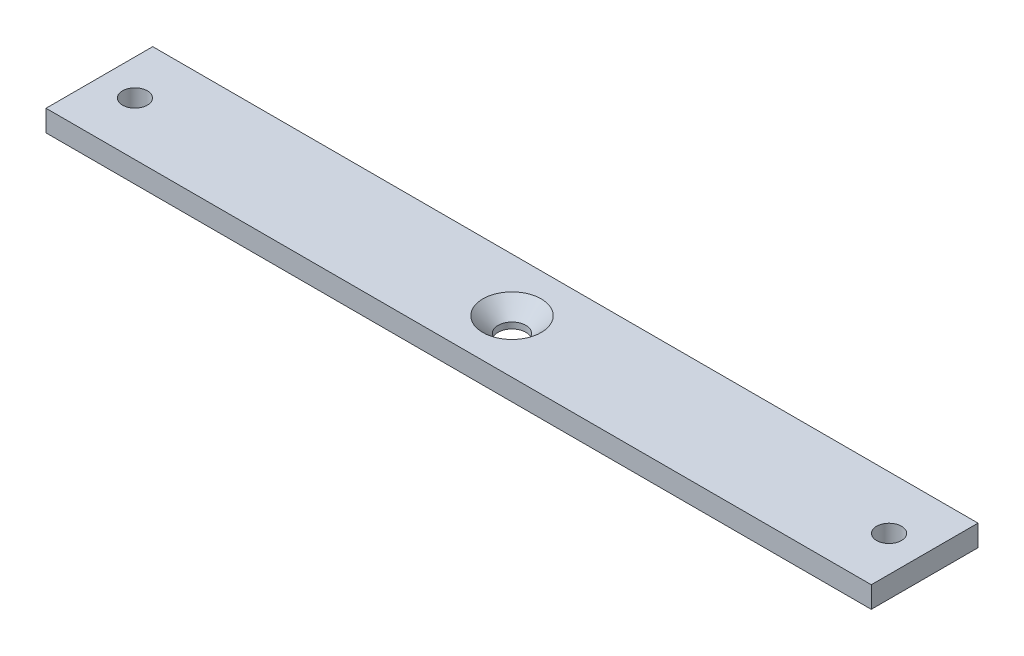
ISO-10303-21;
HEADER;
FILE_DESCRIPTION(('STEP AP214'),'2;1');
FILE_NAME('part.step','',(''),(''),'','','');
FILE_SCHEMA(('AUTOMOTIVE_DESIGN { 1 0 10303 214 1 1 1 1 }'));
ENDSEC;
DATA;
#1=APPLICATION_CONTEXT('core data for automotive mechanical design processes');
#2=APPLICATION_PROTOCOL_DEFINITION('international standard','automotive_design',2000,#1);
#3=PRODUCT_CONTEXT('',#1,'mechanical');
#4=PRODUCT('Part','Part','',(#3));
#5=PRODUCT_RELATED_PRODUCT_CATEGORY('part','',(#4));
#6=PRODUCT_DEFINITION_FORMATION('','',#4);
#7=PRODUCT_DEFINITION_CONTEXT('part definition',#1,'design');
#8=PRODUCT_DEFINITION('design','',#6,#7);
#9=PRODUCT_DEFINITION_SHAPE('','',#8);
#10=(LENGTH_UNIT() NAMED_UNIT(*) SI_UNIT(.MILLI.,.METRE.));
#11=(NAMED_UNIT(*) PLANE_ANGLE_UNIT() SI_UNIT($,.RADIAN.));
#12=(NAMED_UNIT(*) SI_UNIT($,.STERADIAN.) SOLID_ANGLE_UNIT());
#13=UNCERTAINTY_MEASURE_WITH_UNIT(LENGTH_MEASURE(1.E-05),#10,'distance_accuracy_value','');
#14=(GEOMETRIC_REPRESENTATION_CONTEXT(3) GLOBAL_UNCERTAINTY_ASSIGNED_CONTEXT((#13)) GLOBAL_UNIT_ASSIGNED_CONTEXT((#10,
#11,#12)) REPRESENTATION_CONTEXT('',''));
#15=CARTESIAN_POINT('',(0.,0.,0.));
#16=DIRECTION('',(0.,0.,1.));
#17=DIRECTION('',(1.,0.,0.));
#18=AXIS2_PLACEMENT_3D('',#15,#16,#17);
#19=CARTESIAN_POINT('',(0.,-1.5,7.5));
#20=DIRECTION('',(0.,0.,1.));
#21=DIRECTION('',(1.,0.,0.));
#22=AXIS2_PLACEMENT_3D('',#19,#20,#21);
#23=PLANE('',#22);
#24=DIRECTION('',(0.,1.,0.));
#25=VECTOR('',#24,1.);
#26=CARTESIAN_POINT('',(58.,-1.5,7.5));
#27=LINE('',#26,#25);
#28=CARTESIAN_POINT('',(58.,-1.5,7.5));
#29=VERTEX_POINT('',#28);
#30=CARTESIAN_POINT('',(58.,1.5,7.5));
#31=VERTEX_POINT('',#30);
#32=EDGE_CURVE('E47',#29,#31,#27,.T.);
#33=ORIENTED_EDGE('',*,*,#32,.T.);
#34=DIRECTION('',(1.,0.,0.));
#35=VECTOR('',#34,1.);
#36=CARTESIAN_POINT('',(0.,1.5,7.5));
#37=LINE('',#36,#35);
#38=CARTESIAN_POINT('',(-58.,1.5,7.5));
#39=VERTEX_POINT('',#38);
#40=EDGE_CURVE('E85',#39,#31,#37,.T.);
#41=ORIENTED_EDGE('',*,*,#40,.F.);
#42=DIRECTION('',(0.,1.,0.));
#43=VECTOR('',#42,1.);
#44=CARTESIAN_POINT('',(-58.,-1.5,7.5));
#45=LINE('',#44,#43);
#46=CARTESIAN_POINT('',(-58.,-1.5,7.5));
#47=VERTEX_POINT('',#46);
#48=EDGE_CURVE('E11',#47,#39,#45,.T.);
#49=ORIENTED_EDGE('',*,*,#48,.F.);
#50=DIRECTION('',(1.,0.,0.));
#51=VECTOR('',#50,1.);
#52=CARTESIAN_POINT('',(0.,-1.5,7.5));
#53=LINE('',#52,#51);
#54=EDGE_CURVE('E88',#47,#29,#53,.T.);
#55=ORIENTED_EDGE('',*,*,#54,.T.);
#56=EDGE_LOOP('',(#33,#41,#49,#55));
#57=FACE_BOUND('',#56,.T.);
#58=ADVANCED_FACE('F43',(#57),#23,.T.);
#59=CARTESIAN_POINT('',(-58.,-1.5,0.));
#60=DIRECTION('',(1.,0.,0.));
#61=DIRECTION('',(0.,0.,-1.));
#62=AXIS2_PLACEMENT_3D('',#59,#60,#61);
#63=PLANE('',#62);
#64=ORIENTED_EDGE('',*,*,#48,.T.);
#65=DIRECTION('',(0.,0.,-1.));
#66=VECTOR('',#65,1.);
#67=CARTESIAN_POINT('',(-58.,1.5,0.));
#68=LINE('',#67,#66);
#69=CARTESIAN_POINT('',(-58.,1.5,-7.5));
#70=VERTEX_POINT('',#69);
#71=EDGE_CURVE('E106',#39,#70,#68,.T.);
#72=ORIENTED_EDGE('',*,*,#71,.T.);
#73=DIRECTION('',(0.,1.,0.));
#74=VECTOR('',#73,1.);
#75=CARTESIAN_POINT('',(-58.,-1.5,-7.5));
#76=LINE('',#75,#74);
#77=CARTESIAN_POINT('',(-58.,-1.5,-7.5));
#78=VERTEX_POINT('',#77);
#79=EDGE_CURVE('E53',#78,#70,#76,.T.);
#80=ORIENTED_EDGE('',*,*,#79,.F.);
#81=DIRECTION('',(0.,0.,-1.));
#82=VECTOR('',#81,1.);
#83=CARTESIAN_POINT('',(-58.,-1.5,0.));
#84=LINE('',#83,#82);
#85=EDGE_CURVE('E94',#47,#78,#84,.T.);
#86=ORIENTED_EDGE('',*,*,#85,.F.);
#87=EDGE_LOOP('',(#64,#72,#80,#86));
#88=FACE_BOUND('',#87,.T.);
#89=ADVANCED_FACE('F142',(#88),#63,.F.);
#90=CARTESIAN_POINT('',(0.,-1.5,-7.5));
#91=DIRECTION('',(0.,0.,1.));
#92=DIRECTION('',(1.,0.,0.));
#93=AXIS2_PLACEMENT_3D('',#90,#91,#92);
#94=PLANE('',#93);
#95=ORIENTED_EDGE('',*,*,#79,.T.);
#96=DIRECTION('',(1.,0.,0.));
#97=VECTOR('',#96,1.);
#98=CARTESIAN_POINT('',(0.,1.5,-7.5));
#99=LINE('',#98,#97);
#100=CARTESIAN_POINT('',(58.,1.5,-7.5));
#101=VERTEX_POINT('',#100);
#102=EDGE_CURVE('E102',#70,#101,#99,.T.);
#103=ORIENTED_EDGE('',*,*,#102,.T.);
#104=DIRECTION('',(0.,1.,0.));
#105=VECTOR('',#104,1.);
#106=CARTESIAN_POINT('',(58.,-1.5,-7.5));
#107=LINE('',#106,#105);
#108=CARTESIAN_POINT('',(58.,-1.5,-7.5));
#109=VERTEX_POINT('',#108);
#110=EDGE_CURVE('E93',#109,#101,#107,.T.);
#111=ORIENTED_EDGE('',*,*,#110,.F.);
#112=DIRECTION('',(1.,0.,0.));
#113=VECTOR('',#112,1.);
#114=CARTESIAN_POINT('',(0.,-1.5,-7.5));
#115=LINE('',#114,#113);
#116=EDGE_CURVE('E67',#78,#109,#115,.T.);
#117=ORIENTED_EDGE('',*,*,#116,.F.);
#118=EDGE_LOOP('',(#95,#103,#111,#117));
#119=FACE_BOUND('',#118,.T.);
#120=ADVANCED_FACE('F140',(#119),#94,.F.);
#121=CARTESIAN_POINT('',(-53.,-1.5,0.));
#122=DIRECTION('',(0.,1.,0.));
#123=DIRECTION('',(0.,0.,1.));
#124=AXIS2_PLACEMENT_3D('',#121,#122,#123);
#125=CYLINDRICAL_SURFACE('',#124,1.75);
#126=CARTESIAN_POINT('',(-53.,-1.5,0.));
#127=DIRECTION('',(0.,1.,0.));
#128=DIRECTION('',(0.,0.,1.));
#129=AXIS2_PLACEMENT_3D('',#126,#127,#128);
#130=CIRCLE('',#129,1.75);
#131=CARTESIAN_POINT('',(-53.,-1.5,1.75));
#132=VERTEX_POINT('',#131);
#133=EDGE_CURVE('E124',#132,#132,#130,.T.);
#134=ORIENTED_EDGE('',*,*,#133,.F.);
#135=EDGE_LOOP('',(#134));
#136=FACE_BOUND('',#135,.T.);
#137=CARTESIAN_POINT('',(-53.,1.5,0.));
#138=DIRECTION('',(0.,1.,0.));
#139=DIRECTION('',(0.,0.,1.));
#140=AXIS2_PLACEMENT_3D('',#137,#138,#139);
#141=CIRCLE('',#140,1.75);
#142=CARTESIAN_POINT('',(-53.,1.5,1.75));
#143=VERTEX_POINT('',#142);
#144=EDGE_CURVE('E108',#143,#143,#141,.T.);
#145=ORIENTED_EDGE('',*,*,#144,.T.);
#146=EDGE_LOOP('',(#145));
#147=FACE_BOUND('',#146,.T.);
#148=ADVANCED_FACE('F165',(#136,#147),#125,.F.);
#149=CARTESIAN_POINT('',(53.,-1.5,0.));
#150=DIRECTION('',(0.,1.,0.));
#151=DIRECTION('',(0.,0.,1.));
#152=AXIS2_PLACEMENT_3D('',#149,#150,#151);
#153=CYLINDRICAL_SURFACE('',#152,1.75);
#154=CARTESIAN_POINT('',(53.,-1.5,0.));
#155=DIRECTION('',(0.,1.,0.));
#156=DIRECTION('',(0.,0.,1.));
#157=AXIS2_PLACEMENT_3D('',#154,#155,#156);
#158=CIRCLE('',#157,1.75);
#159=CARTESIAN_POINT('',(53.,-1.5,1.75));
#160=VERTEX_POINT('',#159);
#161=EDGE_CURVE('E120',#160,#160,#158,.T.);
#162=ORIENTED_EDGE('',*,*,#161,.F.);
#163=EDGE_LOOP('',(#162));
#164=FACE_BOUND('',#163,.T.);
#165=CARTESIAN_POINT('',(53.,1.5,0.));
#166=DIRECTION('',(0.,1.,0.));
#167=DIRECTION('',(0.,0.,1.));
#168=AXIS2_PLACEMENT_3D('',#165,#166,#167);
#169=CIRCLE('',#168,1.75);
#170=CARTESIAN_POINT('',(53.,1.5,1.75));
#171=VERTEX_POINT('',#170);
#172=EDGE_CURVE('E112',#171,#171,#169,.T.);
#173=ORIENTED_EDGE('',*,*,#172,.T.);
#174=EDGE_LOOP('',(#173));
#175=FACE_BOUND('',#174,.T.);
#176=ADVANCED_FACE('F45',(#164,#175),#153,.F.);
#177=CARTESIAN_POINT('',(58.,-1.5,0.));
#178=DIRECTION('',(1.,0.,0.));
#179=DIRECTION('',(0.,0.,-1.));
#180=AXIS2_PLACEMENT_3D('',#177,#178,#179);
#181=PLANE('',#180);
#182=ORIENTED_EDGE('',*,*,#110,.T.);
#183=DIRECTION('',(0.,0.,-1.));
#184=VECTOR('',#183,1.);
#185=CARTESIAN_POINT('',(58.,1.5,0.));
#186=LINE('',#185,#184);
#187=EDGE_CURVE('E96',#31,#101,#186,.T.);
#188=ORIENTED_EDGE('',*,*,#187,.F.);
#189=ORIENTED_EDGE('',*,*,#32,.F.);
#190=DIRECTION('',(0.,0.,-1.));
#191=VECTOR('',#190,1.);
#192=CARTESIAN_POINT('',(58.,-1.5,0.));
#193=LINE('',#192,#191);
#194=EDGE_CURVE('E130',#29,#109,#193,.T.);
#195=ORIENTED_EDGE('',*,*,#194,.T.);
#196=EDGE_LOOP('',(#182,#188,#189,#195));
#197=FACE_BOUND('',#196,.T.);
#198=ADVANCED_FACE('F97',(#197),#181,.T.);
#199=CARTESIAN_POINT('',(0.,-1.5,0.));
#200=DIRECTION('',(0.,1.,0.));
#201=DIRECTION('',(0.,0.,1.));
#202=AXIS2_PLACEMENT_3D('',#199,#200,#201);
#203=PLANE('',#202);
#204=CARTESIAN_POINT('',(0.,-1.5,0.));
#205=DIRECTION('',(0.,1.,0.));
#206=DIRECTION('',(0.,0.,1.));
#207=AXIS2_PLACEMENT_3D('',#204,#205,#206);
#208=CIRCLE('',#207,1.95);
#209=CARTESIAN_POINT('',(0.,-1.5,1.95));
#210=VERTEX_POINT('',#209);
#211=EDGE_CURVE('E259',#210,#210,#208,.T.);
#212=ORIENTED_EDGE('',*,*,#211,.T.);
#213=EDGE_LOOP('',(#212));
#214=FACE_BOUND('',#213,.T.);
#215=ORIENTED_EDGE('',*,*,#161,.T.);
#216=EDGE_LOOP('',(#215));
#217=FACE_BOUND('',#216,.T.);
#218=ORIENTED_EDGE('',*,*,#133,.T.);
#219=EDGE_LOOP('',(#218));
#220=FACE_BOUND('',#219,.T.);
#221=ORIENTED_EDGE('',*,*,#54,.F.);
#222=ORIENTED_EDGE('',*,*,#85,.T.);
#223=ORIENTED_EDGE('',*,*,#116,.T.);
#224=ORIENTED_EDGE('',*,*,#194,.F.);
#225=EDGE_LOOP('',(#221,#222,#223,#224));
#226=FACE_BOUND('',#225,.T.);
#227=ADVANCED_FACE('F144',(#214,#217,#220,#226),#203,.F.);
#228=CARTESIAN_POINT('',(0.,1.5,0.));
#229=DIRECTION('',(0.,1.,0.));
#230=DIRECTION('',(0.,0.,1.));
#231=AXIS2_PLACEMENT_3D('',#228,#229,#230);
#232=PLANE('',#231);
#233=CARTESIAN_POINT('',(0.,1.5,0.));
#234=DIRECTION('',(0.,1.,0.));
#235=DIRECTION('',(0.,0.,1.));
#236=AXIS2_PLACEMENT_3D('',#233,#234,#235);
#237=CIRCLE('',#236,4.1);
#238=CARTESIAN_POINT('',(0.,1.5,4.1));
#239=VERTEX_POINT('',#238);
#240=EDGE_CURVE('E255',#239,#239,#237,.T.);
#241=ORIENTED_EDGE('',*,*,#240,.F.);
#242=EDGE_LOOP('',(#241));
#243=FACE_BOUND('',#242,.T.);
#244=ORIENTED_EDGE('',*,*,#172,.F.);
#245=EDGE_LOOP('',(#244));
#246=FACE_BOUND('',#245,.T.);
#247=ORIENTED_EDGE('',*,*,#144,.F.);
#248=EDGE_LOOP('',(#247));
#249=FACE_BOUND('',#248,.T.);
#250=ORIENTED_EDGE('',*,*,#40,.T.);
#251=ORIENTED_EDGE('',*,*,#187,.T.);
#252=ORIENTED_EDGE('',*,*,#102,.F.);
#253=ORIENTED_EDGE('',*,*,#71,.F.);
#254=EDGE_LOOP('',(#250,#251,#252,#253));
#255=FACE_BOUND('',#254,.T.);
#256=ADVANCED_FACE('F104',(#243,#246,#249,#255),#232,.T.);
#257=CARTESIAN_POINT('',(0.,1.5,0.));
#258=DIRECTION('',(0.,1.,0.));
#259=DIRECTION('',(0.,0.,1.));
#260=AXIS2_PLACEMENT_3D('',#257,#258,#259);
#261=CYLINDRICAL_SURFACE('',#260,1.95);
#262=ORIENTED_EDGE('',*,*,#211,.F.);
#263=EDGE_LOOP('',(#262));
#264=FACE_BOUND('',#263,.T.);
#265=CARTESIAN_POINT('',(0.,-0.649999999999999,0.));
#266=DIRECTION('',(0.,1.,0.));
#267=DIRECTION('',(0.,0.,1.));
#268=AXIS2_PLACEMENT_3D('',#265,#266,#267);
#269=CIRCLE('',#268,1.95);
#270=CARTESIAN_POINT('',(0.,-0.649999999999999,1.95));
#271=VERTEX_POINT('',#270);
#272=EDGE_CURVE('E252',#271,#271,#269,.T.);
#273=ORIENTED_EDGE('',*,*,#272,.T.);
#274=EDGE_LOOP('',(#273));
#275=FACE_BOUND('',#274,.T.);
#276=ADVANCED_FACE('F152',(#264,#275),#261,.F.);
#277=CARTESIAN_POINT('',(0.,1.5,0.));
#278=DIRECTION('',(0.,1.,0.));
#279=DIRECTION('',(0.,0.,1.));
#280=AXIS2_PLACEMENT_3D('',#277,#278,#279);
#281=CONICAL_SURFACE('',#280,4.1,0.785398163397449);
#282=ORIENTED_EDGE('',*,*,#272,.F.);
#283=EDGE_LOOP('',(#282));
#284=FACE_BOUND('',#283,.T.);
#285=ORIENTED_EDGE('',*,*,#240,.T.);
#286=EDGE_LOOP('',(#285));
#287=FACE_BOUND('',#286,.T.);
#288=ADVANCED_FACE('F231',(#284,#287),#281,.F.);
#289=CLOSED_SHELL('',(#58,#89,#120,#148,#176,#198,#227,#256,#276,#288));
#290=MANIFOLD_SOLID_BREP('B2',#289);
#291=ADVANCED_BREP_SHAPE_REPRESENTATION('',(#18,#290),#14);
#292=SHAPE_DEFINITION_REPRESENTATION(#9,#291);
ENDSEC;
END-ISO-10303-21;
